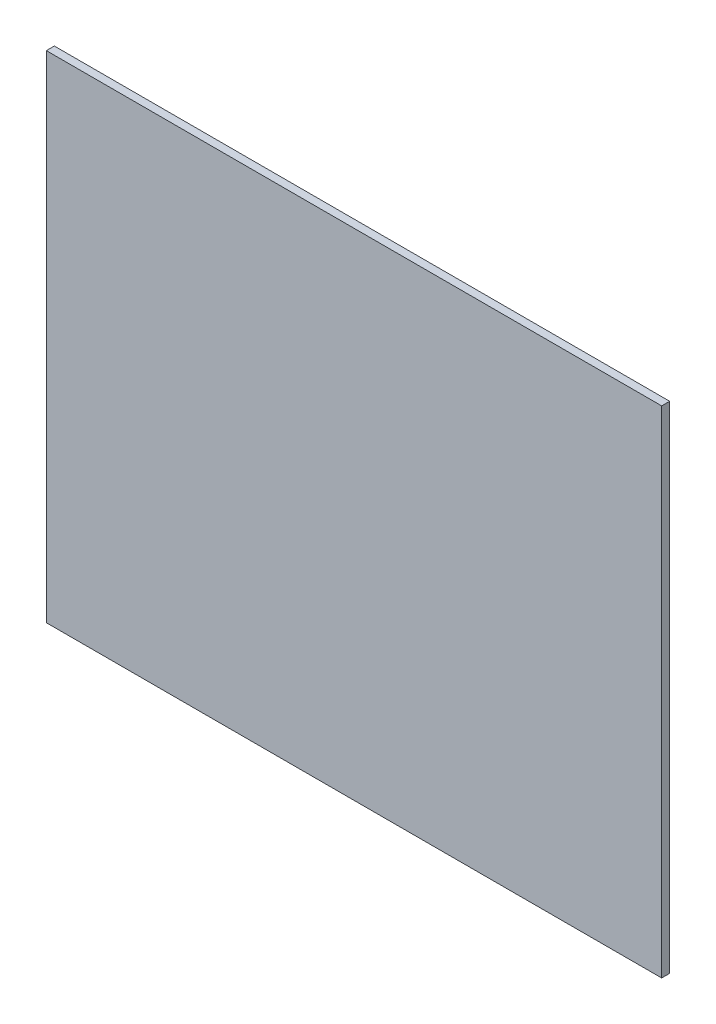
ISO-10303-21;
HEADER;
FILE_DESCRIPTION(('STEP AP214'),'2;1');
FILE_NAME('part.step','',(''),(''),'','','');
FILE_SCHEMA(('AUTOMOTIVE_DESIGN { 1 0 10303 214 1 1 1 1 }'));
ENDSEC;
DATA;
#1=APPLICATION_CONTEXT('core data for automotive mechanical design processes');
#2=APPLICATION_PROTOCOL_DEFINITION('international standard','automotive_design',2000,#1);
#3=PRODUCT_CONTEXT('',#1,'mechanical');
#4=PRODUCT('Part','Part','',(#3));
#5=PRODUCT_RELATED_PRODUCT_CATEGORY('part','',(#4));
#6=PRODUCT_DEFINITION_FORMATION('','',#4);
#7=PRODUCT_DEFINITION_CONTEXT('part definition',#1,'design');
#8=PRODUCT_DEFINITION('design','',#6,#7);
#9=PRODUCT_DEFINITION_SHAPE('','',#8);
#10=(LENGTH_UNIT() NAMED_UNIT(*) SI_UNIT(.MILLI.,.METRE.));
#11=(NAMED_UNIT(*) PLANE_ANGLE_UNIT() SI_UNIT($,.RADIAN.));
#12=(NAMED_UNIT(*) SI_UNIT($,.STERADIAN.) SOLID_ANGLE_UNIT());
#13=UNCERTAINTY_MEASURE_WITH_UNIT(LENGTH_MEASURE(1.E-05),#10,'distance_accuracy_value','');
#14=(GEOMETRIC_REPRESENTATION_CONTEXT(3) GLOBAL_UNCERTAINTY_ASSIGNED_CONTEXT((#13)) GLOBAL_UNIT_ASSIGNED_CONTEXT((#10,
#11,#12)) REPRESENTATION_CONTEXT('',''));
#15=CARTESIAN_POINT('',(0.,0.,0.));
#16=DIRECTION('',(0.,0.,1.));
#17=DIRECTION('',(1.,0.,0.));
#18=AXIS2_PLACEMENT_3D('',#15,#16,#17);
#19=CARTESIAN_POINT('',(0.,0.,2.));
#20=DIRECTION('',(1.,0.,0.));
#21=DIRECTION('',(0.,1.,0.));
#22=AXIS2_PLACEMENT_3D('',#19,#20,#21);
#23=PLANE('',#22);
#24=DIRECTION('',(0.,-1.,0.));
#25=VECTOR('',#24,1.);
#26=CARTESIAN_POINT('',(0.,0.,0.));
#27=LINE('',#26,#25);
#28=CARTESIAN_POINT('',(0.,0.,0.));
#29=VERTEX_POINT('',#28);
#30=CARTESIAN_POINT('',(0.,-124.,0.));
#31=VERTEX_POINT('',#30);
#32=EDGE_CURVE('E107',#29,#31,#27,.T.);
#33=ORIENTED_EDGE('',*,*,#32,.T.);
#34=DIRECTION('',(0.,0.,-1.));
#35=VECTOR('',#34,1.);
#36=CARTESIAN_POINT('',(0.,-124.,2.));
#37=LINE('',#36,#35);
#38=CARTESIAN_POINT('',(0.,-124.,2.));
#39=VERTEX_POINT('',#38);
#40=EDGE_CURVE('E11',#39,#31,#37,.T.);
#41=ORIENTED_EDGE('',*,*,#40,.F.);
#42=DIRECTION('',(0.,-1.,0.));
#43=VECTOR('',#42,1.);
#44=CARTESIAN_POINT('',(0.,0.,2.));
#45=LINE('',#44,#43);
#46=CARTESIAN_POINT('',(0.,0.,2.));
#47=VERTEX_POINT('',#46);
#48=EDGE_CURVE('E91',#47,#39,#45,.T.);
#49=ORIENTED_EDGE('',*,*,#48,.F.);
#50=DIRECTION('',(0.,0.,-1.));
#51=VECTOR('',#50,1.);
#52=CARTESIAN_POINT('',(0.,0.,2.));
#53=LINE('',#52,#51);
#54=EDGE_CURVE('E103',#47,#29,#53,.T.);
#55=ORIENTED_EDGE('',*,*,#54,.T.);
#56=EDGE_LOOP('',(#33,#41,#49,#55));
#57=FACE_BOUND('',#56,.T.);
#58=ADVANCED_FACE('F39',(#57),#23,.F.);
#59=CARTESIAN_POINT('',(0.,-124.,2.));
#60=DIRECTION('',(0.,1.,0.));
#61=DIRECTION('',(0.,0.,1.));
#62=AXIS2_PLACEMENT_3D('',#59,#60,#61);
#63=PLANE('',#62);
#64=DIRECTION('',(1.,0.,0.));
#65=VECTOR('',#64,1.);
#66=CARTESIAN_POINT('',(0.,-124.,0.));
#67=LINE('',#66,#65);
#68=CARTESIAN_POINT('',(154.,-124.,0.));
#69=VERTEX_POINT('',#68);
#70=EDGE_CURVE('E96',#31,#69,#67,.T.);
#71=ORIENTED_EDGE('',*,*,#70,.T.);
#72=DIRECTION('',(0.,0.,-1.));
#73=VECTOR('',#72,1.);
#74=CARTESIAN_POINT('',(154.,-124.,2.));
#75=LINE('',#74,#73);
#76=CARTESIAN_POINT('',(154.,-124.,2.));
#77=VERTEX_POINT('',#76);
#78=EDGE_CURVE('E48',#77,#69,#75,.T.);
#79=ORIENTED_EDGE('',*,*,#78,.F.);
#80=DIRECTION('',(1.,0.,0.));
#81=VECTOR('',#80,1.);
#82=CARTESIAN_POINT('',(0.,-124.,2.));
#83=LINE('',#82,#81);
#84=EDGE_CURVE('E86',#39,#77,#83,.T.);
#85=ORIENTED_EDGE('',*,*,#84,.F.);
#86=ORIENTED_EDGE('',*,*,#40,.T.);
#87=EDGE_LOOP('',(#71,#79,#85,#86));
#88=FACE_BOUND('',#87,.T.);
#89=ADVANCED_FACE('F95',(#88),#63,.F.);
#90=CARTESIAN_POINT('',(154.,0.,2.));
#91=DIRECTION('',(-1.,0.,0.));
#92=DIRECTION('',(0.,-1.,0.));
#93=AXIS2_PLACEMENT_3D('',#90,#91,#92);
#94=PLANE('',#93);
#95=DIRECTION('',(0.,1.,0.));
#96=VECTOR('',#95,1.);
#97=CARTESIAN_POINT('',(154.,0.,0.));
#98=LINE('',#97,#96);
#99=CARTESIAN_POINT('',(154.,0.,0.));
#100=VERTEX_POINT('',#99);
#101=EDGE_CURVE('E73',#69,#100,#98,.T.);
#102=ORIENTED_EDGE('',*,*,#101,.T.);
#103=DIRECTION('',(0.,0.,-1.));
#104=VECTOR('',#103,1.);
#105=CARTESIAN_POINT('',(154.,0.,2.));
#106=LINE('',#105,#104);
#107=CARTESIAN_POINT('',(154.,0.,2.));
#108=VERTEX_POINT('',#107);
#109=EDGE_CURVE('E98',#108,#100,#106,.T.);
#110=ORIENTED_EDGE('',*,*,#109,.F.);
#111=DIRECTION('',(0.,1.,0.));
#112=VECTOR('',#111,1.);
#113=CARTESIAN_POINT('',(154.,0.,2.));
#114=LINE('',#113,#112);
#115=EDGE_CURVE('E89',#77,#108,#114,.T.);
#116=ORIENTED_EDGE('',*,*,#115,.F.);
#117=ORIENTED_EDGE('',*,*,#78,.T.);
#118=EDGE_LOOP('',(#102,#110,#116,#117));
#119=FACE_BOUND('',#118,.T.);
#120=ADVANCED_FACE('F99',(#119),#94,.F.);
#121=CARTESIAN_POINT('',(0.,0.,2.));
#122=DIRECTION('',(0.,-1.,0.));
#123=DIRECTION('',(0.,0.,-1.));
#124=AXIS2_PLACEMENT_3D('',#121,#122,#123);
#125=PLANE('',#124);
#126=DIRECTION('',(-1.,0.,0.));
#127=VECTOR('',#126,1.);
#128=CARTESIAN_POINT('',(0.,0.,0.));
#129=LINE('',#128,#127);
#130=EDGE_CURVE('E79',#100,#29,#129,.T.);
#131=ORIENTED_EDGE('',*,*,#130,.T.);
#132=ORIENTED_EDGE('',*,*,#54,.F.);
#133=DIRECTION('',(-1.,0.,0.));
#134=VECTOR('',#133,1.);
#135=CARTESIAN_POINT('',(0.,0.,2.));
#136=LINE('',#135,#134);
#137=EDGE_CURVE('E56',#108,#47,#136,.T.);
#138=ORIENTED_EDGE('',*,*,#137,.F.);
#139=ORIENTED_EDGE('',*,*,#109,.T.);
#140=EDGE_LOOP('',(#131,#132,#138,#139));
#141=FACE_BOUND('',#140,.T.);
#142=ADVANCED_FACE('F120',(#141),#125,.F.);
#143=CARTESIAN_POINT('',(0.,0.,2.));
#144=DIRECTION('',(0.,0.,1.));
#145=DIRECTION('',(1.,0.,0.));
#146=AXIS2_PLACEMENT_3D('',#143,#144,#145);
#147=PLANE('',#146);
#148=ORIENTED_EDGE('',*,*,#48,.T.);
#149=ORIENTED_EDGE('',*,*,#84,.T.);
#150=ORIENTED_EDGE('',*,*,#115,.T.);
#151=ORIENTED_EDGE('',*,*,#137,.T.);
#152=EDGE_LOOP('',(#148,#149,#150,#151));
#153=FACE_BOUND('',#152,.T.);
#154=ADVANCED_FACE('F87',(#153),#147,.T.);
#155=CARTESIAN_POINT('',(0.,0.,0.));
#156=DIRECTION('',(0.,0.,1.));
#157=DIRECTION('',(1.,0.,0.));
#158=AXIS2_PLACEMENT_3D('',#155,#156,#157);
#159=PLANE('',#158);
#160=ORIENTED_EDGE('',*,*,#32,.F.);
#161=ORIENTED_EDGE('',*,*,#130,.F.);
#162=ORIENTED_EDGE('',*,*,#101,.F.);
#163=ORIENTED_EDGE('',*,*,#70,.F.);
#164=EDGE_LOOP('',(#160,#161,#162,#163));
#165=FACE_BOUND('',#164,.T.);
#166=ADVANCED_FACE('F123',(#165),#159,.F.);
#167=CLOSED_SHELL('',(#58,#89,#120,#142,#154,#166));
#168=MANIFOLD_SOLID_BREP('B2',#167);
#169=ADVANCED_BREP_SHAPE_REPRESENTATION('',(#18,#168),#14);
#170=SHAPE_DEFINITION_REPRESENTATION(#9,#169);
ENDSEC;
END-ISO-10303-21;
